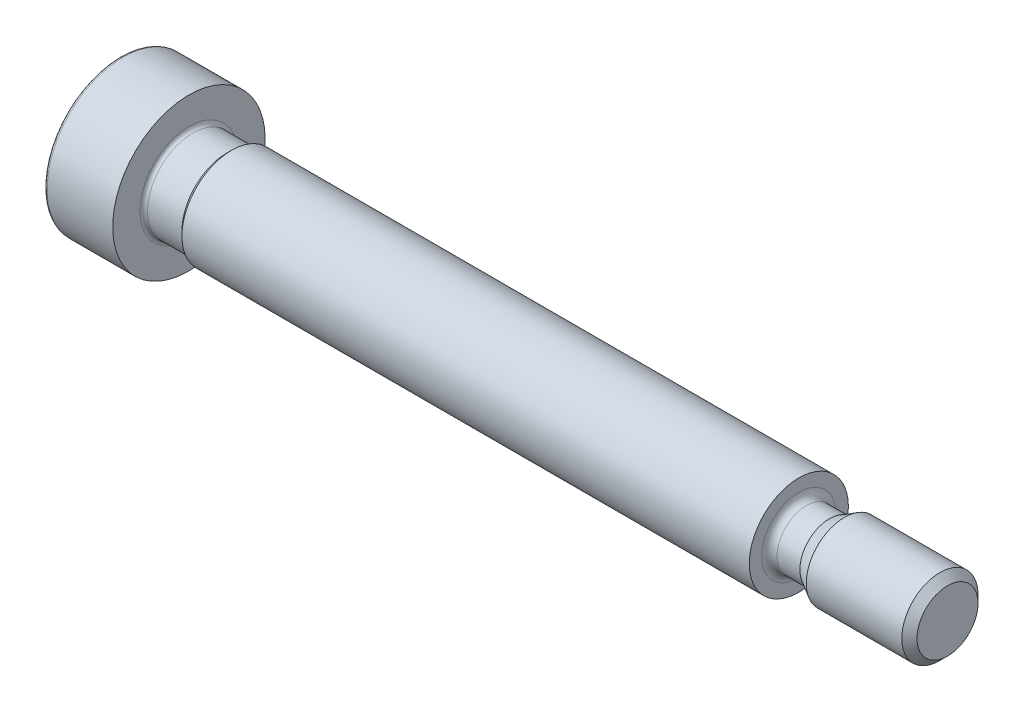
ISO-10303-21;
HEADER;
FILE_DESCRIPTION(('STEP AP214'),'2;1');
FILE_NAME('part.step','',(''),(''),'','','');
FILE_SCHEMA(('AUTOMOTIVE_DESIGN { 1 0 10303 214 1 1 1 1 }'));
ENDSEC;
DATA;
#1=APPLICATION_CONTEXT('core data for automotive mechanical design processes');
#2=APPLICATION_PROTOCOL_DEFINITION('international standard','automotive_design',2000,#1);
#3=PRODUCT_CONTEXT('',#1,'mechanical');
#4=PRODUCT('Part','Part','',(#3));
#5=PRODUCT_RELATED_PRODUCT_CATEGORY('part','',(#4));
#6=PRODUCT_DEFINITION_FORMATION('','',#4);
#7=PRODUCT_DEFINITION_CONTEXT('part definition',#1,'design');
#8=PRODUCT_DEFINITION('design','',#6,#7);
#9=PRODUCT_DEFINITION_SHAPE('','',#8);
#10=(LENGTH_UNIT() NAMED_UNIT(*) SI_UNIT(.MILLI.,.METRE.));
#11=(NAMED_UNIT(*) PLANE_ANGLE_UNIT() SI_UNIT($,.RADIAN.));
#12=(NAMED_UNIT(*) SI_UNIT($,.STERADIAN.) SOLID_ANGLE_UNIT());
#13=UNCERTAINTY_MEASURE_WITH_UNIT(LENGTH_MEASURE(1.E-05),#10,'distance_accuracy_value','');
#14=(GEOMETRIC_REPRESENTATION_CONTEXT(3) GLOBAL_UNCERTAINTY_ASSIGNED_CONTEXT((#13)) GLOBAL_UNIT_ASSIGNED_CONTEXT((#10,
#11,#12)) REPRESENTATION_CONTEXT('',''));
#15=CARTESIAN_POINT('',(0.,0.,0.));
#16=DIRECTION('',(0.,0.,1.));
#17=DIRECTION('',(1.,0.,0.));
#18=AXIS2_PLACEMENT_3D('',#15,#16,#17);
#19=CARTESIAN_POINT('',(44.5,0.,0.));
#20=DIRECTION('',(1.,0.,0.));
#21=DIRECTION('',(0.,0.,-1.));
#22=AXIS2_PLACEMENT_3D('',#19,#20,#21);
#23=PLANE('',#22);
#24=CARTESIAN_POINT('',(44.5,0.,0.));
#25=DIRECTION('',(1.,0.,0.));
#26=DIRECTION('',(0.,0.,-1.));
#27=AXIS2_PLACEMENT_3D('',#24,#25,#26);
#28=CIRCLE('',#27,2.43);
#29=CARTESIAN_POINT('',(44.5,0.,-2.43));
#30=VERTEX_POINT('',#29);
#31=EDGE_CURVE('E143',#30,#30,#28,.F.);
#32=ORIENTED_EDGE('',*,*,#31,.T.);
#33=EDGE_LOOP('',(#32));
#34=FACE_BOUND('',#33,.T.);
#35=CARTESIAN_POINT('',(44.5,0.,0.));
#36=DIRECTION('',(1.,0.,0.));
#37=DIRECTION('',(0.,0.,-1.));
#38=AXIS2_PLACEMENT_3D('',#35,#36,#37);
#39=CIRCLE('',#38,3.25);
#40=CARTESIAN_POINT('',(44.5,0.,-3.25));
#41=VERTEX_POINT('',#40);
#42=EDGE_CURVE('E131',#41,#41,#39,.T.);
#43=ORIENTED_EDGE('',*,*,#42,.T.);
#44=EDGE_LOOP('',(#43));
#45=FACE_BOUND('',#44,.T.);
#46=ADVANCED_FACE('F37',(#34,#45),#23,.T.);
#47=CARTESIAN_POINT('',(44.5,0.,0.));
#48=DIRECTION('',(-1.,0.,0.));
#49=DIRECTION('',(0.,0.,1.));
#50=AXIS2_PLACEMENT_3D('',#47,#48,#49);
#51=CYLINDRICAL_SURFACE('',#50,3.25);
#52=CARTESIAN_POINT('',(7.29,0.,0.));
#53=DIRECTION('',(1.,0.,0.));
#54=DIRECTION('',(0.,1.,0.));
#55=AXIS2_PLACEMENT_3D('',#52,#53,#54);
#56=CIRCLE('',#55,3.25);
#57=CARTESIAN_POINT('',(7.29,3.25,0.));
#58=VERTEX_POINT('',#57);
#59=EDGE_CURVE('E147',#58,#58,#56,.T.);
#60=ORIENTED_EDGE('',*,*,#59,.T.);
#61=EDGE_LOOP('',(#60));
#62=FACE_BOUND('',#61,.T.);
#63=ORIENTED_EDGE('',*,*,#42,.F.);
#64=EDGE_LOOP('',(#63));
#65=FACE_BOUND('',#64,.T.);
#66=ADVANCED_FACE('F172',(#62,#65),#51,.T.);
#67=CARTESIAN_POINT('',(46.5,0.,0.));
#68=DIRECTION('',(1.,0.,0.));
#69=DIRECTION('',(0.,1.,0.));
#70=AXIS2_PLACEMENT_3D('',#67,#68,#69);
#71=CONICAL_SURFACE('',#70,1.93,0.523598775598294);
#72=CARTESIAN_POINT('',(46.5,0.,0.));
#73=DIRECTION('',(1.,0.,0.));
#74=DIRECTION('',(0.,1.,0.));
#75=AXIS2_PLACEMENT_3D('',#72,#73,#74);
#76=CIRCLE('',#75,1.93);
#77=CARTESIAN_POINT('',(46.5,1.93,0.));
#78=VERTEX_POINT('',#77);
#79=EDGE_CURVE('E127',#78,#78,#76,.T.);
#80=ORIENTED_EDGE('',*,*,#79,.T.);
#81=EDGE_LOOP('',(#80));
#82=FACE_BOUND('',#81,.T.);
#83=CARTESIAN_POINT('',(47.4872689603143,0.,0.));
#84=DIRECTION('',(1.,0.,0.));
#85=DIRECTION('',(0.,1.,0.));
#86=AXIS2_PLACEMENT_3D('',#83,#84,#85);
#87=CIRCLE('',#86,2.5);
#88=CARTESIAN_POINT('',(47.4872689603143,2.50000000000001,0.));
#89=VERTEX_POINT('',#88);
#90=EDGE_CURVE('E130',#89,#89,#87,.T.);
#91=ORIENTED_EDGE('',*,*,#90,.F.);
#92=EDGE_LOOP('',(#91));
#93=FACE_BOUND('',#92,.T.);
#94=ADVANCED_FACE('F178',(#82,#93),#71,.T.);
#95=CARTESIAN_POINT('',(13.0280306886804,0.,0.));
#96=DIRECTION('',(1.,0.,0.));
#97=DIRECTION('',(0.,1.,0.));
#98=AXIS2_PLACEMENT_3D('',#95,#96,#97);
#99=CYLINDRICAL_SURFACE('',#98,1.93);
#100=CARTESIAN_POINT('',(45.,0.,0.));
#101=DIRECTION('',(1.,0.,0.));
#102=DIRECTION('',(0.,0.,-1.));
#103=AXIS2_PLACEMENT_3D('',#100,#101,#102);
#104=CIRCLE('',#103,1.93);
#105=CARTESIAN_POINT('',(45.,0.,-1.93));
#106=VERTEX_POINT('',#105);
#107=EDGE_CURVE('E138',#106,#106,#104,.T.);
#108=ORIENTED_EDGE('',*,*,#107,.T.);
#109=EDGE_LOOP('',(#108));
#110=FACE_BOUND('',#109,.T.);
#111=ORIENTED_EDGE('',*,*,#79,.F.);
#112=EDGE_LOOP('',(#111));
#113=FACE_BOUND('',#112,.T.);
#114=ADVANCED_FACE('F212',(#110,#113),#99,.T.);
#115=CARTESIAN_POINT('',(54.25,0.,0.));
#116=DIRECTION('',(1.,0.,0.));
#117=DIRECTION('',(0.,0.,-1.));
#118=AXIS2_PLACEMENT_3D('',#115,#116,#117);
#119=PLANE('',#118);
#120=CARTESIAN_POINT('',(54.25,0.,0.));
#121=DIRECTION('',(1.,0.,0.));
#122=DIRECTION('',(0.,0.,-1.));
#123=AXIS2_PLACEMENT_3D('',#120,#121,#122);
#124=CIRCLE('',#123,2.);
#125=CARTESIAN_POINT('',(54.25,0.,-2.));
#126=VERTEX_POINT('',#125);
#127=EDGE_CURVE('E146',#126,#126,#124,.T.);
#128=ORIENTED_EDGE('',*,*,#127,.T.);
#129=EDGE_LOOP('',(#128));
#130=FACE_BOUND('',#129,.T.);
#131=ADVANCED_FACE('F206',(#130),#119,.T.);
#132=CARTESIAN_POINT('',(54.25,0.,0.));
#133=DIRECTION('',(-1.,0.,0.));
#134=DIRECTION('',(0.,0.,1.));
#135=AXIS2_PLACEMENT_3D('',#132,#133,#134);
#136=CYLINDRICAL_SURFACE('',#135,2.5);
#137=CARTESIAN_POINT('',(53.75,0.,0.));
#138=DIRECTION('',(1.,0.,0.));
#139=DIRECTION('',(0.,0.,-1.));
#140=AXIS2_PLACEMENT_3D('',#137,#138,#139);
#141=CIRCLE('',#140,2.5);
#142=CARTESIAN_POINT('',(53.75,0.,-2.5));
#143=VERTEX_POINT('',#142);
#144=EDGE_CURVE('E154',#143,#143,#141,.F.);
#145=ORIENTED_EDGE('',*,*,#144,.T.);
#146=EDGE_LOOP('',(#145));
#147=FACE_BOUND('',#146,.T.);
#148=ORIENTED_EDGE('',*,*,#90,.T.);
#149=EDGE_LOOP('',(#148));
#150=FACE_BOUND('',#149,.T.);
#151=ADVANCED_FACE('F183',(#147,#150),#136,.T.);
#152=CARTESIAN_POINT('',(45.,0.,0.));
#153=DIRECTION('',(1.,0.,0.));
#154=DIRECTION('',(0.,0.,-1.));
#155=AXIS2_PLACEMENT_3D('',#152,#153,#154);
#156=TOROIDAL_SURFACE('',#155,2.43,0.5);
#157=ORIENTED_EDGE('',*,*,#31,.F.);
#158=EDGE_LOOP('',(#157));
#159=FACE_BOUND('',#158,.T.);
#160=ORIENTED_EDGE('',*,*,#107,.F.);
#161=EDGE_LOOP('',(#160));
#162=FACE_BOUND('',#161,.T.);
#163=ADVANCED_FACE('F195',(#159,#162),#156,.F.);
#164=CARTESIAN_POINT('',(7.,0.,0.));
#165=DIRECTION('',(1.,0.,0.));
#166=DIRECTION('',(0.,1.,0.));
#167=AXIS2_PLACEMENT_3D('',#164,#165,#166);
#168=CONICAL_SURFACE('',#167,2.96,0.78539816339745);
#169=CARTESIAN_POINT('',(7.,0.,0.));
#170=DIRECTION('',(1.,0.,0.));
#171=DIRECTION('',(0.,1.,0.));
#172=AXIS2_PLACEMENT_3D('',#169,#170,#171);
#173=CIRCLE('',#172,2.96);
#174=CARTESIAN_POINT('',(7.,2.96,0.));
#175=VERTEX_POINT('',#174);
#176=EDGE_CURVE('E477',#175,#175,#173,.T.);
#177=ORIENTED_EDGE('',*,*,#176,.T.);
#178=EDGE_LOOP('',(#177));
#179=FACE_BOUND('',#178,.T.);
#180=ORIENTED_EDGE('',*,*,#59,.F.);
#181=EDGE_LOOP('',(#180));
#182=FACE_BOUND('',#181,.T.);
#183=ADVANCED_FACE('F197',(#179,#182),#168,.T.);
#184=CARTESIAN_POINT('',(4.75,0.,0.));
#185=DIRECTION('',(1.,0.,0.));
#186=DIRECTION('',(0.,1.,0.));
#187=AXIS2_PLACEMENT_3D('',#184,#185,#186);
#188=TOROIDAL_SURFACE('',#187,3.21,0.249999999999999);
#189=CARTESIAN_POINT('',(4.75,0.,0.));
#190=DIRECTION('',(1.,0.,0.));
#191=DIRECTION('',(0.,1.,0.));
#192=AXIS2_PLACEMENT_3D('',#189,#190,#191);
#193=CIRCLE('',#192,2.96);
#194=CARTESIAN_POINT('',(4.75,2.96,0.));
#195=VERTEX_POINT('',#194);
#196=EDGE_CURVE('E474',#195,#195,#193,.T.);
#197=ORIENTED_EDGE('',*,*,#196,.F.);
#198=EDGE_LOOP('',(#197));
#199=FACE_BOUND('',#198,.T.);
#200=CARTESIAN_POINT('',(4.5,0.,0.));
#201=DIRECTION('',(1.,0.,0.));
#202=DIRECTION('',(0.,1.,0.));
#203=AXIS2_PLACEMENT_3D('',#200,#201,#202);
#204=CIRCLE('',#203,3.21);
#205=CARTESIAN_POINT('',(4.5,3.21,0.));
#206=VERTEX_POINT('',#205);
#207=EDGE_CURVE('E151',#206,#206,#204,.T.);
#208=ORIENTED_EDGE('',*,*,#207,.T.);
#209=EDGE_LOOP('',(#208));
#210=FACE_BOUND('',#209,.T.);
#211=ADVANCED_FACE('F203',(#199,#210),#188,.F.);
#212=CARTESIAN_POINT('',(12.5320641195354,0.,0.));
#213=DIRECTION('',(1.,0.,0.));
#214=DIRECTION('',(0.,1.,0.));
#215=AXIS2_PLACEMENT_3D('',#212,#213,#214);
#216=CYLINDRICAL_SURFACE('',#215,2.96);
#217=ORIENTED_EDGE('',*,*,#176,.F.);
#218=EDGE_LOOP('',(#217));
#219=FACE_BOUND('',#218,.T.);
#220=ORIENTED_EDGE('',*,*,#196,.T.);
#221=EDGE_LOOP('',(#220));
#222=FACE_BOUND('',#221,.T.);
#223=ADVANCED_FACE('F283',(#219,#222),#216,.T.);
#224=CARTESIAN_POINT('',(2.4,-1.5,0.866025403784438));
#225=DIRECTION('',(0.86602540378444,-0.499999999999998,0.));
#226=DIRECTION('',(0.499999999999998,0.86602540378444,0.));
#227=AXIS2_PLACEMENT_3D('',#224,#225,#226);
#228=PLANE('',#227);
#229=DIRECTION('',(0.,0.,-1.));
#230=VECTOR('',#229,1.);
#231=CARTESIAN_POINT('',(2.4,-1.5,0.866025403784438));
#232=LINE('',#231,#230);
#233=CARTESIAN_POINT('',(2.4,-1.5,0.866025403784438));
#234=VERTEX_POINT('',#233);
#235=CARTESIAN_POINT('',(2.4,-1.5,-0.866025403784442));
#236=VERTEX_POINT('',#235);
#237=EDGE_CURVE('E120',#234,#236,#232,.T.);
#238=ORIENTED_EDGE('',*,*,#237,.F.);
#239=DIRECTION('',(-0.447213595499956,-0.774596669241484,0.447213595499958));
#240=VECTOR('',#239,1.);
#241=CARTESIAN_POINT('',(2.4,-1.5,0.866025403784438));
#242=LINE('',#241,#240);
#243=CARTESIAN_POINT('',(3.26602540378443,0.,0.));
#244=VERTEX_POINT('',#243);
#245=EDGE_CURVE('E449',#244,#234,#242,.T.);
#246=ORIENTED_EDGE('',*,*,#245,.F.);
#247=DIRECTION('',(-0.447213595499956,-0.774596669241484,-0.447213595499958));
#248=VECTOR('',#247,1.);
#249=CARTESIAN_POINT('',(2.4,-1.5,-0.866025403784442));
#250=LINE('',#249,#248);
#251=EDGE_CURVE('E463',#244,#236,#250,.T.);
#252=ORIENTED_EDGE('',*,*,#251,.T.);
#253=EDGE_LOOP('',(#238,#246,#252));
#254=FACE_BOUND('',#253,.T.);
#255=ADVANCED_FACE('F287',(#254),#228,.F.);
#256=CARTESIAN_POINT('',(2.4,0.,1.73205080756888));
#257=DIRECTION('',(0.86602540378444,-0.249999999999999,0.433012701892218));
#258=DIRECTION('',(0.447213595499956,0.,-0.894427190999917));
#259=AXIS2_PLACEMENT_3D('',#256,#257,#258);
#260=PLANE('',#259);
#261=DIRECTION('',(0.,-0.866025403784438,-0.5));
#262=VECTOR('',#261,1.);
#263=CARTESIAN_POINT('',(2.4,0.,1.73205080756888));
#264=LINE('',#263,#262);
#265=CARTESIAN_POINT('',(2.4,0.,1.73205080756888));
#266=VERTEX_POINT('',#265);
#267=EDGE_CURVE('E454',#266,#234,#264,.T.);
#268=ORIENTED_EDGE('',*,*,#267,.F.);
#269=DIRECTION('',(-0.447213595499956,0.,0.894427190999917));
#270=VECTOR('',#269,1.);
#271=CARTESIAN_POINT('',(2.4,0.,1.73205080756888));
#272=LINE('',#271,#270);
#273=EDGE_CURVE('E446',#244,#266,#272,.T.);
#274=ORIENTED_EDGE('',*,*,#273,.F.);
#275=ORIENTED_EDGE('',*,*,#245,.T.);
#276=EDGE_LOOP('',(#268,#274,#275));
#277=FACE_BOUND('',#276,.T.);
#278=ADVANCED_FACE('F351',(#277),#260,.F.);
#279=CARTESIAN_POINT('',(2.4,1.5,0.866025403784439));
#280=DIRECTION('',(0.86602540378444,0.249999999999999,0.433012701892217));
#281=DIRECTION('',(0.447213595499956,0.,-0.894427190999917));
#282=AXIS2_PLACEMENT_3D('',#279,#280,#281);
#283=PLANE('',#282);
#284=DIRECTION('',(0.,-0.866025403784438,0.5));
#285=VECTOR('',#284,1.);
#286=CARTESIAN_POINT('',(2.4,1.5,0.866025403784439));
#287=LINE('',#286,#285);
#288=CARTESIAN_POINT('',(2.4,1.5,0.866025403784439));
#289=VERTEX_POINT('',#288);
#290=EDGE_CURVE('E92',#289,#266,#287,.T.);
#291=ORIENTED_EDGE('',*,*,#290,.F.);
#292=DIRECTION('',(-0.447213595499956,0.774596669241484,0.447213595499958));
#293=VECTOR('',#292,1.);
#294=CARTESIAN_POINT('',(2.4,1.5,0.866025403784439));
#295=LINE('',#294,#293);
#296=EDGE_CURVE('E150',#244,#289,#295,.T.);
#297=ORIENTED_EDGE('',*,*,#296,.F.);
#298=ORIENTED_EDGE('',*,*,#273,.T.);
#299=EDGE_LOOP('',(#291,#297,#298));
#300=FACE_BOUND('',#299,.T.);
#301=ADVANCED_FACE('F321',(#300),#283,.F.);
#302=CARTESIAN_POINT('',(2.4,1.5,-0.866025403784437));
#303=DIRECTION('',(0.86602540378444,0.499999999999998,0.));
#304=DIRECTION('',(-0.499999999999998,0.86602540378444,0.));
#305=AXIS2_PLACEMENT_3D('',#302,#303,#304);
#306=PLANE('',#305);
#307=DIRECTION('',(0.,0.,1.));
#308=VECTOR('',#307,1.);
#309=CARTESIAN_POINT('',(2.4,1.5,-0.866025403784437));
#310=LINE('',#309,#308);
#311=CARTESIAN_POINT('',(2.4,1.5,-0.866025403784437));
#312=VERTEX_POINT('',#311);
#313=EDGE_CURVE('E61',#312,#289,#310,.T.);
#314=ORIENTED_EDGE('',*,*,#313,.F.);
#315=DIRECTION('',(-0.447213595499956,0.774596669241484,-0.447213595499958));
#316=VECTOR('',#315,1.);
#317=CARTESIAN_POINT('',(2.4,1.5,-0.866025403784437));
#318=LINE('',#317,#316);
#319=EDGE_CURVE('E469',#244,#312,#318,.T.);
#320=ORIENTED_EDGE('',*,*,#319,.F.);
#321=ORIENTED_EDGE('',*,*,#296,.T.);
#322=EDGE_LOOP('',(#314,#320,#321));
#323=FACE_BOUND('',#322,.T.);
#324=ADVANCED_FACE('F316',(#323),#306,.F.);
#325=CARTESIAN_POINT('',(2.4,0.,-1.73205080756888));
#326=DIRECTION('',(0.86602540378444,0.249999999999999,-0.433012701892218));
#327=DIRECTION('',(-0.447213595499956,0.,-0.894427190999917));
#328=AXIS2_PLACEMENT_3D('',#325,#326,#327);
#329=PLANE('',#328);
#330=DIRECTION('',(0.,0.866025403784439,0.5));
#331=VECTOR('',#330,1.);
#332=CARTESIAN_POINT('',(2.4,0.,-1.73205080756888));
#333=LINE('',#332,#331);
#334=CARTESIAN_POINT('',(2.4,0.,-1.73205080756888));
#335=VERTEX_POINT('',#334);
#336=EDGE_CURVE('E458',#335,#312,#333,.T.);
#337=ORIENTED_EDGE('',*,*,#336,.F.);
#338=DIRECTION('',(-0.447213595499956,0.,-0.894427190999917));
#339=VECTOR('',#338,1.);
#340=CARTESIAN_POINT('',(2.4,0.,-1.73205080756888));
#341=LINE('',#340,#339);
#342=EDGE_CURVE('E466',#244,#335,#341,.T.);
#343=ORIENTED_EDGE('',*,*,#342,.F.);
#344=ORIENTED_EDGE('',*,*,#319,.T.);
#345=EDGE_LOOP('',(#337,#343,#344));
#346=FACE_BOUND('',#345,.T.);
#347=ADVANCED_FACE('F320',(#346),#329,.F.);
#348=CARTESIAN_POINT('',(2.4,-1.5,-0.866025403784442));
#349=DIRECTION('',(0.86602540378444,-0.249999999999999,-0.433012701892218));
#350=DIRECTION('',(-0.447213595499956,0.,-0.894427190999917));
#351=AXIS2_PLACEMENT_3D('',#348,#349,#350);
#352=PLANE('',#351);
#353=DIRECTION('',(0.,0.866025403784439,-0.5));
#354=VECTOR('',#353,1.);
#355=CARTESIAN_POINT('',(2.4,-1.5,-0.866025403784442));
#356=LINE('',#355,#354);
#357=EDGE_CURVE('E117',#236,#335,#356,.T.);
#358=ORIENTED_EDGE('',*,*,#357,.F.);
#359=ORIENTED_EDGE('',*,*,#251,.F.);
#360=ORIENTED_EDGE('',*,*,#342,.T.);
#361=EDGE_LOOP('',(#358,#359,#360));
#362=FACE_BOUND('',#361,.T.);
#363=ADVANCED_FACE('F331',(#362),#352,.F.);
#364=CARTESIAN_POINT('',(2.4,-1.5,0.866025403784438));
#365=DIRECTION('',(0.,1.,0.));
#366=DIRECTION('',(0.,0.,1.));
#367=AXIS2_PLACEMENT_3D('',#364,#365,#366);
#368=PLANE('',#367);
#369=DIRECTION('',(0.,0.,-1.));
#370=VECTOR('',#369,1.);
#371=CARTESIAN_POINT('',(0.,-1.5,0.866025403784438));
#372=LINE('',#371,#370);
#373=CARTESIAN_POINT('',(0.,-1.5,0.866025403784438));
#374=VERTEX_POINT('',#373);
#375=CARTESIAN_POINT('',(0.,-1.5,-0.866025403784442));
#376=VERTEX_POINT('',#375);
#377=EDGE_CURVE('E105',#374,#376,#372,.T.);
#378=ORIENTED_EDGE('',*,*,#377,.F.);
#379=DIRECTION('',(-1.,0.,0.));
#380=VECTOR('',#379,1.);
#381=CARTESIAN_POINT('',(2.4,-1.5,0.866025403784438));
#382=LINE('',#381,#380);
#383=EDGE_CURVE('E96',#234,#374,#382,.T.);
#384=ORIENTED_EDGE('',*,*,#383,.F.);
#385=ORIENTED_EDGE('',*,*,#237,.T.);
#386=DIRECTION('',(-1.,0.,0.));
#387=VECTOR('',#386,1.);
#388=CARTESIAN_POINT('',(2.4,-1.5,-0.866025403784442));
#389=LINE('',#388,#387);
#390=EDGE_CURVE('E118',#236,#376,#389,.T.);
#391=ORIENTED_EDGE('',*,*,#390,.T.);
#392=EDGE_LOOP('',(#378,#384,#385,#391));
#393=FACE_BOUND('',#392,.T.);
#394=ADVANCED_FACE('F341',(#393),#368,.T.);
#395=CARTESIAN_POINT('',(2.4,0.,1.73205080756888));
#396=DIRECTION('',(0.,0.5,-0.866025403784438));
#397=DIRECTION('',(0.,0.866025403784438,0.5));
#398=AXIS2_PLACEMENT_3D('',#395,#396,#397);
#399=PLANE('',#398);
#400=DIRECTION('',(0.,-0.866025403784438,-0.5));
#401=VECTOR('',#400,1.);
#402=CARTESIAN_POINT('',(0.,0.,1.73205080756888));
#403=LINE('',#402,#401);
#404=CARTESIAN_POINT('',(0.,0.,1.73205080756888));
#405=VERTEX_POINT('',#404);
#406=EDGE_CURVE('E99',#405,#374,#403,.T.);
#407=ORIENTED_EDGE('',*,*,#406,.F.);
#408=DIRECTION('',(-1.,0.,0.));
#409=VECTOR('',#408,1.);
#410=CARTESIAN_POINT('',(2.4,0.,1.73205080756888));
#411=LINE('',#410,#409);
#412=EDGE_CURVE('E83',#266,#405,#411,.T.);
#413=ORIENTED_EDGE('',*,*,#412,.F.);
#414=ORIENTED_EDGE('',*,*,#267,.T.);
#415=ORIENTED_EDGE('',*,*,#383,.T.);
#416=EDGE_LOOP('',(#407,#413,#414,#415));
#417=FACE_BOUND('',#416,.T.);
#418=ADVANCED_FACE('F100',(#417),#399,.T.);
#419=CARTESIAN_POINT('',(2.4,1.5,0.866025403784439));
#420=DIRECTION('',(0.,-0.5,-0.866025403784438));
#421=DIRECTION('',(0.,0.866025403784439,-0.5));
#422=AXIS2_PLACEMENT_3D('',#419,#420,#421);
#423=PLANE('',#422);
#424=DIRECTION('',(0.,-0.866025403784438,0.5));
#425=VECTOR('',#424,1.);
#426=CARTESIAN_POINT('',(0.,1.5,0.866025403784439));
#427=LINE('',#426,#425);
#428=CARTESIAN_POINT('',(0.,1.5,0.866025403784439));
#429=VERTEX_POINT('',#428);
#430=EDGE_CURVE('E88',#429,#405,#427,.T.);
#431=ORIENTED_EDGE('',*,*,#430,.F.);
#432=DIRECTION('',(-1.,0.,0.));
#433=VECTOR('',#432,1.);
#434=CARTESIAN_POINT('',(2.4,1.5,0.866025403784439));
#435=LINE('',#434,#433);
#436=EDGE_CURVE('E95',#289,#429,#435,.T.);
#437=ORIENTED_EDGE('',*,*,#436,.F.);
#438=ORIENTED_EDGE('',*,*,#290,.T.);
#439=ORIENTED_EDGE('',*,*,#412,.T.);
#440=EDGE_LOOP('',(#431,#437,#438,#439));
#441=FACE_BOUND('',#440,.T.);
#442=ADVANCED_FACE('F85',(#441),#423,.T.);
#443=CARTESIAN_POINT('',(2.4,1.5,-0.866025403784437));
#444=DIRECTION('',(0.,-1.,0.));
#445=DIRECTION('',(0.,0.,-1.));
#446=AXIS2_PLACEMENT_3D('',#443,#444,#445);
#447=PLANE('',#446);
#448=DIRECTION('',(0.,0.,1.));
#449=VECTOR('',#448,1.);
#450=CARTESIAN_POINT('',(0.,1.5,-0.866025403784437));
#451=LINE('',#450,#449);
#452=CARTESIAN_POINT('',(0.,1.5,-0.866025403784437));
#453=VERTEX_POINT('',#452);
#454=EDGE_CURVE('E110',#453,#429,#451,.T.);
#455=ORIENTED_EDGE('',*,*,#454,.F.);
#456=DIRECTION('',(-1.,0.,0.));
#457=VECTOR('',#456,1.);
#458=CARTESIAN_POINT('',(2.4,1.5,-0.866025403784437));
#459=LINE('',#458,#457);
#460=EDGE_CURVE('E123',#312,#453,#459,.T.);
#461=ORIENTED_EDGE('',*,*,#460,.F.);
#462=ORIENTED_EDGE('',*,*,#313,.T.);
#463=ORIENTED_EDGE('',*,*,#436,.T.);
#464=EDGE_LOOP('',(#455,#461,#462,#463));
#465=FACE_BOUND('',#464,.T.);
#466=ADVANCED_FACE('F394',(#465),#447,.T.);
#467=CARTESIAN_POINT('',(2.4,0.,-1.73205080756888));
#468=DIRECTION('',(0.,-0.5,0.866025403784439));
#469=DIRECTION('',(0.,-0.866025403784439,-0.5));
#470=AXIS2_PLACEMENT_3D('',#467,#468,#469);
#471=PLANE('',#470);
#472=DIRECTION('',(0.,0.866025403784439,0.5));
#473=VECTOR('',#472,1.);
#474=CARTESIAN_POINT('',(0.,0.,-1.73205080756888));
#475=LINE('',#474,#473);
#476=CARTESIAN_POINT('',(0.,0.,-1.73205080756888));
#477=VERTEX_POINT('',#476);
#478=EDGE_CURVE('E112',#477,#453,#475,.T.);
#479=ORIENTED_EDGE('',*,*,#478,.F.);
#480=DIRECTION('',(-1.,0.,0.));
#481=VECTOR('',#480,1.);
#482=CARTESIAN_POINT('',(2.4,0.,-1.73205080756888));
#483=LINE('',#482,#481);
#484=EDGE_CURVE('E125',#335,#477,#483,.T.);
#485=ORIENTED_EDGE('',*,*,#484,.F.);
#486=ORIENTED_EDGE('',*,*,#336,.T.);
#487=ORIENTED_EDGE('',*,*,#460,.T.);
#488=EDGE_LOOP('',(#479,#485,#486,#487));
#489=FACE_BOUND('',#488,.T.);
#490=ADVANCED_FACE('F403',(#489),#471,.T.);
#491=CARTESIAN_POINT('',(2.4,-1.5,-0.866025403784442));
#492=DIRECTION('',(0.,0.5,0.866025403784439));
#493=DIRECTION('',(0.,-0.866025403784439,0.5));
#494=AXIS2_PLACEMENT_3D('',#491,#492,#493);
#495=PLANE('',#494);
#496=DIRECTION('',(0.,0.866025403784439,-0.5));
#497=VECTOR('',#496,1.);
#498=CARTESIAN_POINT('',(0.,-1.5,-0.866025403784442));
#499=LINE('',#498,#497);
#500=EDGE_CURVE('E52',#376,#477,#499,.T.);
#501=ORIENTED_EDGE('',*,*,#500,.F.);
#502=ORIENTED_EDGE('',*,*,#390,.F.);
#503=ORIENTED_EDGE('',*,*,#357,.T.);
#504=ORIENTED_EDGE('',*,*,#484,.T.);
#505=EDGE_LOOP('',(#501,#502,#503,#504));
#506=FACE_BOUND('',#505,.T.);
#507=ADVANCED_FACE('F191',(#506),#495,.T.);
#508=CARTESIAN_POINT('',(0.,0.,0.));
#509=DIRECTION('',(1.,0.,0.));
#510=DIRECTION('',(0.,0.,-1.));
#511=AXIS2_PLACEMENT_3D('',#508,#509,#510);
#512=PLANE('',#511);
#513=CARTESIAN_POINT('',(0.,0.,0.));
#514=DIRECTION('',(1.,0.,0.));
#515=DIRECTION('',(0.,0.,-1.));
#516=AXIS2_PLACEMENT_3D('',#513,#514,#515);
#517=CIRCLE('',#516,4.8);
#518=CARTESIAN_POINT('',(0.,0.,-4.8));
#519=VERTEX_POINT('',#518);
#520=EDGE_CURVE('E11',#519,#519,#517,.F.);
#521=ORIENTED_EDGE('',*,*,#520,.T.);
#522=EDGE_LOOP('',(#521));
#523=FACE_BOUND('',#522,.T.);
#524=ORIENTED_EDGE('',*,*,#500,.T.);
#525=ORIENTED_EDGE('',*,*,#478,.T.);
#526=ORIENTED_EDGE('',*,*,#454,.T.);
#527=ORIENTED_EDGE('',*,*,#430,.T.);
#528=ORIENTED_EDGE('',*,*,#406,.T.);
#529=ORIENTED_EDGE('',*,*,#377,.T.);
#530=EDGE_LOOP('',(#524,#525,#526,#527,#528,#529));
#531=FACE_BOUND('',#530,.T.);
#532=ADVANCED_FACE('F107',(#523,#531),#512,.F.);
#533=CARTESIAN_POINT('',(4.5,0.,0.));
#534=DIRECTION('',(-1.,0.,0.));
#535=DIRECTION('',(0.,0.,1.));
#536=AXIS2_PLACEMENT_3D('',#533,#534,#535);
#537=CYLINDRICAL_SURFACE('',#536,5.);
#538=CARTESIAN_POINT('',(0.2,0.,0.));
#539=DIRECTION('',(1.,0.,0.));
#540=DIRECTION('',(0.,0.,-1.));
#541=AXIS2_PLACEMENT_3D('',#538,#539,#540);
#542=CIRCLE('',#541,5.);
#543=CARTESIAN_POINT('',(0.2,0.,-5.));
#544=VERTEX_POINT('',#543);
#545=EDGE_CURVE('E45',#544,#544,#542,.T.);
#546=ORIENTED_EDGE('',*,*,#545,.T.);
#547=EDGE_LOOP('',(#546));
#548=FACE_BOUND('',#547,.T.);
#549=CARTESIAN_POINT('',(4.5,0.,0.));
#550=DIRECTION('',(1.,0.,0.));
#551=DIRECTION('',(0.,0.,-1.));
#552=AXIS2_PLACEMENT_3D('',#549,#550,#551);
#553=CIRCLE('',#552,5.);
#554=CARTESIAN_POINT('',(4.5,0.,-5.));
#555=VERTEX_POINT('',#554);
#556=EDGE_CURVE('E134',#555,#555,#553,.T.);
#557=ORIENTED_EDGE('',*,*,#556,.F.);
#558=EDGE_LOOP('',(#557));
#559=FACE_BOUND('',#558,.T.);
#560=ADVANCED_FACE('F159',(#548,#559),#537,.T.);
#561=CARTESIAN_POINT('',(4.5,0.,0.));
#562=DIRECTION('',(1.,0.,0.));
#563=DIRECTION('',(0.,0.,-1.));
#564=AXIS2_PLACEMENT_3D('',#561,#562,#563);
#565=PLANE('',#564);
#566=ORIENTED_EDGE('',*,*,#556,.T.);
#567=EDGE_LOOP('',(#566));
#568=FACE_BOUND('',#567,.T.);
#569=ORIENTED_EDGE('',*,*,#207,.F.);
#570=EDGE_LOOP('',(#569));
#571=FACE_BOUND('',#570,.T.);
#572=ADVANCED_FACE('F168',(#568,#571),#565,.T.);
#573=CARTESIAN_POINT('',(54.25,0.,0.));
#574=DIRECTION('',(-1.,0.,0.));
#575=DIRECTION('',(0.,0.,1.));
#576=AXIS2_PLACEMENT_3D('',#573,#574,#575);
#577=CONICAL_SURFACE('',#576,2.,0.785398163397447);
#578=ORIENTED_EDGE('',*,*,#144,.F.);
#579=EDGE_LOOP('',(#578));
#580=FACE_BOUND('',#579,.T.);
#581=ORIENTED_EDGE('',*,*,#127,.F.);
#582=EDGE_LOOP('',(#581));
#583=FACE_BOUND('',#582,.T.);
#584=ADVANCED_FACE('F163',(#580,#583),#577,.T.);
#585=CARTESIAN_POINT('',(0.2,0.,0.));
#586=DIRECTION('',(1.,0.,0.));
#587=DIRECTION('',(0.,0.,-1.));
#588=AXIS2_PLACEMENT_3D('',#585,#586,#587);
#589=TOROIDAL_SURFACE('',#588,4.8,0.2);
#590=ORIENTED_EDGE('',*,*,#520,.F.);
#591=EDGE_LOOP('',(#590));
#592=FACE_BOUND('',#591,.T.);
#593=ORIENTED_EDGE('',*,*,#545,.F.);
#594=EDGE_LOOP('',(#593));
#595=FACE_BOUND('',#594,.T.);
#596=ADVANCED_FACE('F39',(#592,#595),#589,.T.);
#597=CLOSED_SHELL('',(#46,#66,#94,#114,#131,#151,#163,#183,#211,#223,#255,#278,#301,#324,#347,
#363,#394,#418,#442,#466,#490,#507,#532,#560,#572,#584,#596));
#598=MANIFOLD_SOLID_BREP('B2',#597);
#599=ADVANCED_BREP_SHAPE_REPRESENTATION('',(#18,#598),#14);
#600=SHAPE_DEFINITION_REPRESENTATION(#9,#599);
ENDSEC;
END-ISO-10303-21;
